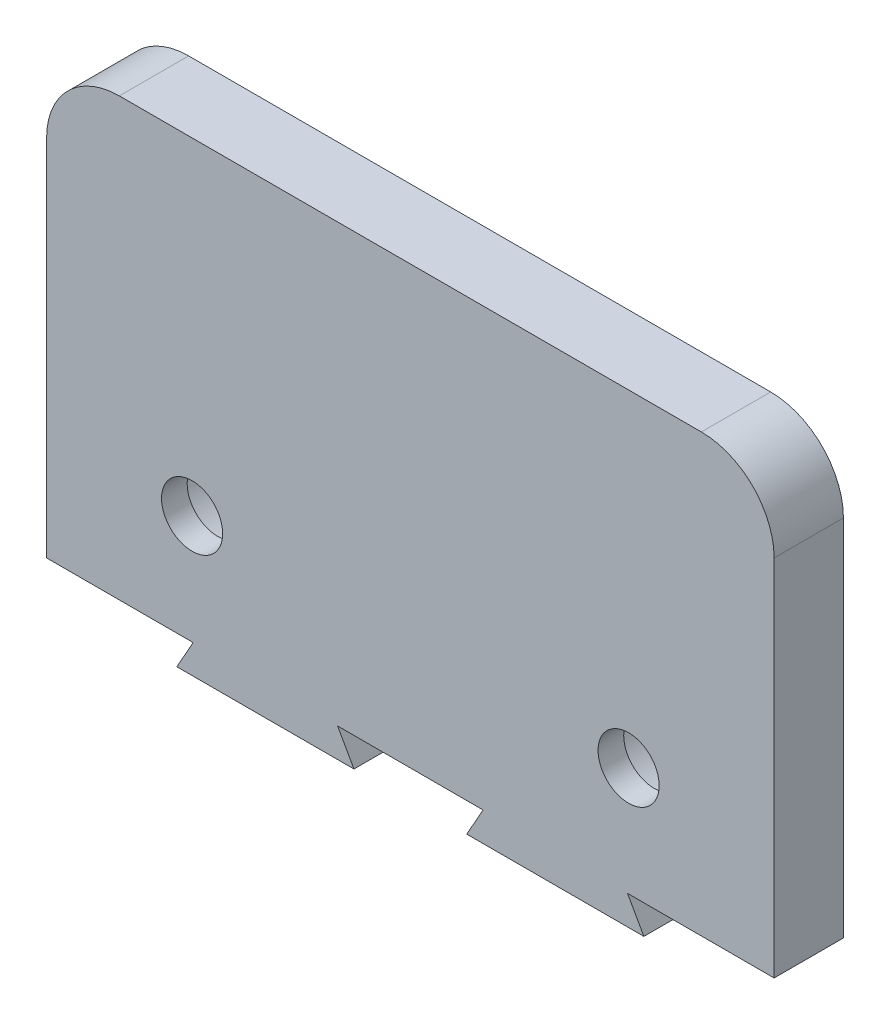
ISO-10303-21;
HEADER;
FILE_DESCRIPTION(('STEP AP214'),'2;1');
FILE_NAME('part.step','',(''),(''),'','','');
FILE_SCHEMA(('AUTOMOTIVE_DESIGN { 1 0 10303 214 1 1 1 1 }'));
ENDSEC;
DATA;
#1=APPLICATION_CONTEXT('core data for automotive mechanical design processes');
#2=APPLICATION_PROTOCOL_DEFINITION('international standard','automotive_design',2000,#1);
#3=PRODUCT_CONTEXT('',#1,'mechanical');
#4=PRODUCT('Part','Part','',(#3));
#5=PRODUCT_RELATED_PRODUCT_CATEGORY('part','',(#4));
#6=PRODUCT_DEFINITION_FORMATION('','',#4);
#7=PRODUCT_DEFINITION_CONTEXT('part definition',#1,'design');
#8=PRODUCT_DEFINITION('design','',#6,#7);
#9=PRODUCT_DEFINITION_SHAPE('','',#8);
#10=(LENGTH_UNIT() NAMED_UNIT(*) SI_UNIT(.MILLI.,.METRE.));
#11=(NAMED_UNIT(*) PLANE_ANGLE_UNIT() SI_UNIT($,.RADIAN.));
#12=(NAMED_UNIT(*) SI_UNIT($,.STERADIAN.) SOLID_ANGLE_UNIT());
#13=UNCERTAINTY_MEASURE_WITH_UNIT(LENGTH_MEASURE(1.E-05),#10,'distance_accuracy_value','');
#14=(GEOMETRIC_REPRESENTATION_CONTEXT(3) GLOBAL_UNCERTAINTY_ASSIGNED_CONTEXT((#13)) GLOBAL_UNIT_ASSIGNED_CONTEXT((#10,
#11,#12)) REPRESENTATION_CONTEXT('',''));
#15=CARTESIAN_POINT('',(0.,0.,0.));
#16=DIRECTION('',(0.,0.,1.));
#17=DIRECTION('',(1.,0.,0.));
#18=AXIS2_PLACEMENT_3D('',#15,#16,#17);
#19=CARTESIAN_POINT('',(0.,0.,0.));
#20=DIRECTION('',(0.,1.,0.));
#21=DIRECTION('',(0.,0.,1.));
#22=AXIS2_PLACEMENT_3D('',#19,#20,#21);
#23=PLANE('',#22);
#24=DIRECTION('',(1.,0.,0.));
#25=VECTOR('',#24,1.);
#26=CARTESIAN_POINT('',(50.0000000000001,0.,4.7625));
#27=LINE('',#26,#25);
#28=CARTESIAN_POINT('',(29.85,0.,4.76250000000001));
#29=VERTEX_POINT('',#28);
#30=CARTESIAN_POINT('',(50.0000000000001,0.,4.7625));
#31=VERTEX_POINT('',#30);
#32=EDGE_CURVE('E170',#29,#31,#27,.T.);
#33=ORIENTED_EDGE('',*,*,#32,.F.);
#34=DIRECTION('',(0.,0.,-1.));
#35=VECTOR('',#34,1.);
#36=CARTESIAN_POINT('',(29.85,0.,4.76250000000001));
#37=LINE('',#36,#35);
#38=CARTESIAN_POINT('',(29.85,0.,-4.7625));
#39=VERTEX_POINT('',#38);
#40=EDGE_CURVE('E154',#29,#39,#37,.T.);
#41=ORIENTED_EDGE('',*,*,#40,.T.);
#42=DIRECTION('',(-1.,0.,0.));
#43=VECTOR('',#42,1.);
#44=CARTESIAN_POINT('',(50.0000000000001,0.,-4.7625));
#45=LINE('',#44,#43);
#46=CARTESIAN_POINT('',(50.0000000000001,0.,-4.7625));
#47=VERTEX_POINT('',#46);
#48=EDGE_CURVE('E168',#47,#39,#45,.T.);
#49=ORIENTED_EDGE('',*,*,#48,.F.);
#50=DIRECTION('',(0.,0.,-1.));
#51=VECTOR('',#50,1.);
#52=CARTESIAN_POINT('',(50.0000000000001,0.,4.7625));
#53=LINE('',#52,#51);
#54=EDGE_CURVE('E188',#31,#47,#53,.T.);
#55=ORIENTED_EDGE('',*,*,#54,.F.);
#56=EDGE_LOOP('',(#33,#41,#49,#55));
#57=FACE_BOUND('',#56,.T.);
#58=ADVANCED_FACE('F48',(#57),#23,.F.);
#59=DIRECTION('',(0.,0.,-1.));
#60=VECTOR('',#59,1.);
#61=CARTESIAN_POINT('',(-29.85,0.,4.76250000000001));
#62=LINE('',#61,#60);
#63=CARTESIAN_POINT('',(-29.85,0.,4.76250000000001));
#64=VERTEX_POINT('',#63);
#65=CARTESIAN_POINT('',(-29.85,0.,-4.7625));
#66=VERTEX_POINT('',#65);
#67=EDGE_CURVE('E210',#64,#66,#62,.T.);
#68=ORIENTED_EDGE('',*,*,#67,.F.);
#69=CARTESIAN_POINT('',(-50.,0.,4.76250000000001));
#70=VERTEX_POINT('',#69);
#71=EDGE_CURVE('E192',#70,#64,#27,.T.);
#72=ORIENTED_EDGE('',*,*,#71,.F.);
#73=DIRECTION('',(0.,0.,1.));
#74=VECTOR('',#73,1.);
#75=CARTESIAN_POINT('',(-50.,0.,4.76250000000001));
#76=LINE('',#75,#74);
#77=CARTESIAN_POINT('',(-50.,0.,-4.76249999999999));
#78=VERTEX_POINT('',#77);
#79=EDGE_CURVE('E197',#78,#70,#76,.T.);
#80=ORIENTED_EDGE('',*,*,#79,.F.);
#81=EDGE_CURVE('E181',#66,#78,#45,.T.);
#82=ORIENTED_EDGE('',*,*,#81,.F.);
#83=EDGE_LOOP('',(#68,#72,#80,#82));
#84=FACE_BOUND('',#83,.T.);
#85=ADVANCED_FACE('F296',(#84),#23,.F.);
#86=CARTESIAN_POINT('',(-50.,60.,4.76250000000001));
#87=DIRECTION('',(1.,0.,0.));
#88=DIRECTION('',(0.,0.,-1.));
#89=AXIS2_PLACEMENT_3D('',#86,#87,#88);
#90=PLANE('',#89);
#91=DIRECTION('',(0.,-1.,0.));
#92=VECTOR('',#91,1.);
#93=CARTESIAN_POINT('',(-50.,60.,4.76250000000001));
#94=LINE('',#93,#92);
#95=CARTESIAN_POINT('',(-50.,50.,4.76250000000001));
#96=VERTEX_POINT('',#95);
#97=EDGE_CURVE('E332',#96,#70,#94,.T.);
#98=ORIENTED_EDGE('',*,*,#97,.F.);
#99=DIRECTION('',(0.,0.,1.));
#100=VECTOR('',#99,1.);
#101=CARTESIAN_POINT('',(-50.,50.,-4.76249999999999));
#102=LINE('',#101,#100);
#103=CARTESIAN_POINT('',(-50.,50.,-4.76249999999999));
#104=VERTEX_POINT('',#103);
#105=EDGE_CURVE('E13',#96,#104,#102,.F.);
#106=ORIENTED_EDGE('',*,*,#105,.T.);
#107=DIRECTION('',(0.,-1.,0.));
#108=VECTOR('',#107,1.);
#109=CARTESIAN_POINT('',(-50.,60.,-4.76249999999999));
#110=LINE('',#109,#108);
#111=EDGE_CURVE('E202',#104,#78,#110,.T.);
#112=ORIENTED_EDGE('',*,*,#111,.T.);
#113=ORIENTED_EDGE('',*,*,#79,.T.);
#114=EDGE_LOOP('',(#98,#106,#112,#113));
#115=FACE_BOUND('',#114,.T.);
#116=ADVANCED_FACE('F302',(#115),#90,.F.);
#117=CARTESIAN_POINT('',(50.0000000000001,60.,4.7625));
#118=DIRECTION('',(0.,0.,-1.));
#119=DIRECTION('',(-1.,0.,0.));
#120=AXIS2_PLACEMENT_3D('',#117,#118,#119);
#121=PLANE('',#120);
#122=CARTESIAN_POINT('',(30.,15.,4.7625));
#123=DIRECTION('',(0.,0.,-1.));
#124=DIRECTION('',(-1.,0.,0.));
#125=AXIS2_PLACEMENT_3D('',#122,#123,#124);
#126=CIRCLE('',#125,4.2);
#127=CARTESIAN_POINT('',(25.8,15.,4.7625));
#128=VERTEX_POINT('',#127);
#129=EDGE_CURVE('E52',#128,#128,#126,.T.);
#130=ORIENTED_EDGE('',*,*,#129,.T.);
#131=EDGE_LOOP('',(#130));
#132=FACE_BOUND('',#131,.T.);
#133=CARTESIAN_POINT('',(-30.,15.,4.76250000000001));
#134=DIRECTION('',(0.,0.,-1.));
#135=DIRECTION('',(-1.,0.,0.));
#136=AXIS2_PLACEMENT_3D('',#133,#134,#135);
#137=CIRCLE('',#136,4.2);
#138=CARTESIAN_POINT('',(-34.2,15.,4.76250000000001));
#139=VERTEX_POINT('',#138);
#140=EDGE_CURVE('E162',#139,#139,#137,.T.);
#141=ORIENTED_EDGE('',*,*,#140,.T.);
#142=EDGE_LOOP('',(#141));
#143=FACE_BOUND('',#142,.T.);
#144=DIRECTION('',(0.,-1.,0.));
#145=VECTOR('',#144,1.);
#146=CARTESIAN_POINT('',(50.0000000000001,60.,4.7625));
#147=LINE('',#146,#145);
#148=CARTESIAN_POINT('',(50.0000000000001,50.,4.7625));
#149=VERTEX_POINT('',#148);
#150=EDGE_CURVE('E330',#149,#31,#147,.T.);
#151=ORIENTED_EDGE('',*,*,#150,.F.);
#152=CARTESIAN_POINT('',(40.0000000000001,50.,4.7625));
#153=DIRECTION('',(0.,0.,-1.));
#154=DIRECTION('',(-1.,0.,0.));
#155=AXIS2_PLACEMENT_3D('',#152,#153,#154);
#156=CIRCLE('',#155,10.);
#157=CARTESIAN_POINT('',(40.0000000000001,60.,4.7625));
#158=VERTEX_POINT('',#157);
#159=EDGE_CURVE('E57',#149,#158,#156,.F.);
#160=ORIENTED_EDGE('',*,*,#159,.T.);
#161=DIRECTION('',(1.,0.,0.));
#162=VECTOR('',#161,1.);
#163=CARTESIAN_POINT('',(50.0000000000001,60.,4.7625));
#164=LINE('',#163,#162);
#165=CARTESIAN_POINT('',(-39.9999999999999,60.,4.76250000000001));
#166=VERTEX_POINT('',#165);
#167=EDGE_CURVE('E178',#166,#158,#164,.T.);
#168=ORIENTED_EDGE('',*,*,#167,.F.);
#169=CARTESIAN_POINT('',(-39.9999999999999,50.,4.76250000000001));
#170=DIRECTION('',(0.,0.,-1.));
#171=DIRECTION('',(-1.,0.,0.));
#172=AXIS2_PLACEMENT_3D('',#169,#170,#171);
#173=CIRCLE('',#172,10.);
#174=EDGE_CURVE('E65',#166,#96,#173,.F.);
#175=ORIENTED_EDGE('',*,*,#174,.T.);
#176=ORIENTED_EDGE('',*,*,#97,.T.);
#177=ORIENTED_EDGE('',*,*,#71,.T.);
#178=DIRECTION('',(-0.490261239632559,-0.871575537124549,0.));
#179=VECTOR('',#178,1.);
#180=CARTESIAN_POINT('',(-32.1,-4.,4.76250000000001));
#181=LINE('',#180,#179);
#182=CARTESIAN_POINT('',(-32.1,-4.,4.76250000000001));
#183=VERTEX_POINT('',#182);
#184=EDGE_CURVE('E218',#64,#183,#181,.T.);
#185=ORIENTED_EDGE('',*,*,#184,.T.);
#186=DIRECTION('',(1.,0.,0.));
#187=VECTOR('',#186,1.);
#188=CARTESIAN_POINT('',(-7.75,-4.,4.76250000000001));
#189=LINE('',#188,#187);
#190=CARTESIAN_POINT('',(-7.75,-4.,4.76250000000001));
#191=VERTEX_POINT('',#190);
#192=EDGE_CURVE('E216',#183,#191,#189,.T.);
#193=ORIENTED_EDGE('',*,*,#192,.T.);
#194=DIRECTION('',(-0.490261239632559,0.871575537124549,0.));
#195=VECTOR('',#194,1.);
#196=CARTESIAN_POINT('',(-10.,0.,4.76250000000001));
#197=LINE('',#196,#195);
#198=CARTESIAN_POINT('',(-10.,0.,4.7625));
#199=VERTEX_POINT('',#198);
#200=EDGE_CURVE('E213',#191,#199,#197,.T.);
#201=ORIENTED_EDGE('',*,*,#200,.T.);
#202=CARTESIAN_POINT('',(10.,0.,4.76250000000001));
#203=VERTEX_POINT('',#202);
#204=EDGE_CURVE('E194',#199,#203,#27,.T.);
#205=ORIENTED_EDGE('',*,*,#204,.T.);
#206=DIRECTION('',(0.490261239632559,0.871575537124549,0.));
#207=VECTOR('',#206,1.);
#208=CARTESIAN_POINT('',(10.,0.,4.76250000000001));
#209=LINE('',#208,#207);
#210=CARTESIAN_POINT('',(7.75,-4.,4.76250000000001));
#211=VERTEX_POINT('',#210);
#212=EDGE_CURVE('E237',#211,#203,#209,.T.);
#213=ORIENTED_EDGE('',*,*,#212,.F.);
#214=DIRECTION('',(-1.,0.,0.));
#215=VECTOR('',#214,1.);
#216=CARTESIAN_POINT('',(7.75,-4.,4.76250000000001));
#217=LINE('',#216,#215);
#218=CARTESIAN_POINT('',(32.1,-4.,4.76250000000001));
#219=VERTEX_POINT('',#218);
#220=EDGE_CURVE('E234',#219,#211,#217,.T.);
#221=ORIENTED_EDGE('',*,*,#220,.F.);
#222=DIRECTION('',(0.490261239632559,-0.871575537124549,0.));
#223=VECTOR('',#222,1.);
#224=CARTESIAN_POINT('',(32.1,-4.,4.76250000000001));
#225=LINE('',#224,#223);
#226=EDGE_CURVE('E239',#29,#219,#225,.T.);
#227=ORIENTED_EDGE('',*,*,#226,.F.);
#228=ORIENTED_EDGE('',*,*,#32,.T.);
#229=EDGE_LOOP('',(#151,#160,#168,#175,#176,#177,#185,#193,#201,#205,#213,#221,#227,#228));
#230=FACE_BOUND('',#229,.T.);
#231=ADVANCED_FACE('F327',(#132,#143,#230),#121,.F.);
#232=CARTESIAN_POINT('',(50.0000000000001,60.,4.7625));
#233=DIRECTION('',(-1.,0.,0.));
#234=DIRECTION('',(0.,0.,1.));
#235=AXIS2_PLACEMENT_3D('',#232,#233,#234);
#236=PLANE('',#235);
#237=DIRECTION('',(0.,-1.,0.));
#238=VECTOR('',#237,1.);
#239=CARTESIAN_POINT('',(50.0000000000001,60.,-4.7625));
#240=LINE('',#239,#238);
#241=CARTESIAN_POINT('',(50.0000000000001,50.,-4.7625));
#242=VERTEX_POINT('',#241);
#243=EDGE_CURVE('E176',#242,#47,#240,.T.);
#244=ORIENTED_EDGE('',*,*,#243,.F.);
#245=DIRECTION('',(0.,0.,-1.));
#246=VECTOR('',#245,1.);
#247=CARTESIAN_POINT('',(50.0000000000001,50.,4.7625));
#248=LINE('',#247,#246);
#249=EDGE_CURVE('E73',#242,#149,#248,.F.);
#250=ORIENTED_EDGE('',*,*,#249,.T.);
#251=ORIENTED_EDGE('',*,*,#150,.T.);
#252=ORIENTED_EDGE('',*,*,#54,.T.);
#253=EDGE_LOOP('',(#244,#250,#251,#252));
#254=FACE_BOUND('',#253,.T.);
#255=ADVANCED_FACE('F274',(#254),#236,.F.);
#256=CARTESIAN_POINT('',(50.0000000000001,60.,-4.7625));
#257=DIRECTION('',(0.,0.,1.));
#258=DIRECTION('',(1.,0.,0.));
#259=AXIS2_PLACEMENT_3D('',#256,#257,#258);
#260=PLANE('',#259);
#261=CARTESIAN_POINT('',(30.,15.,-4.7625));
#262=DIRECTION('',(0.,0.,-1.));
#263=DIRECTION('',(-1.,0.,0.));
#264=AXIS2_PLACEMENT_3D('',#261,#262,#263);
#265=CIRCLE('',#264,9.025);
#266=CARTESIAN_POINT('',(20.975,15.,-4.7625));
#267=VERTEX_POINT('',#266);
#268=EDGE_CURVE('E265',#267,#267,#265,.T.);
#269=ORIENTED_EDGE('',*,*,#268,.F.);
#270=EDGE_LOOP('',(#269));
#271=FACE_BOUND('',#270,.T.);
#272=CARTESIAN_POINT('',(-30.,15.,-4.76249999999999));
#273=DIRECTION('',(0.,0.,-1.));
#274=DIRECTION('',(-1.,0.,0.));
#275=AXIS2_PLACEMENT_3D('',#272,#273,#274);
#276=CIRCLE('',#275,9.025);
#277=CARTESIAN_POINT('',(-39.025,15.,-4.76249999999999));
#278=VERTEX_POINT('',#277);
#279=EDGE_CURVE('E253',#278,#278,#276,.T.);
#280=ORIENTED_EDGE('',*,*,#279,.F.);
#281=EDGE_LOOP('',(#280));
#282=FACE_BOUND('',#281,.T.);
#283=DIRECTION('',(-1.,0.,0.));
#284=VECTOR('',#283,1.);
#285=CARTESIAN_POINT('',(50.0000000000001,60.,-4.7625));
#286=LINE('',#285,#284);
#287=CARTESIAN_POINT('',(40.0000000000001,60.,-4.7625));
#288=VERTEX_POINT('',#287);
#289=CARTESIAN_POINT('',(-39.9999999999999,60.,-4.76249999999999));
#290=VERTEX_POINT('',#289);
#291=EDGE_CURVE('E183',#288,#290,#286,.T.);
#292=ORIENTED_EDGE('',*,*,#291,.F.);
#293=CARTESIAN_POINT('',(40.0000000000001,50.,-4.7625));
#294=DIRECTION('',(0.,0.,1.));
#295=DIRECTION('',(1.,0.,0.));
#296=AXIS2_PLACEMENT_3D('',#293,#294,#295);
#297=CIRCLE('',#296,10.);
#298=EDGE_CURVE('E387',#288,#242,#297,.F.);
#299=ORIENTED_EDGE('',*,*,#298,.T.);
#300=ORIENTED_EDGE('',*,*,#243,.T.);
#301=ORIENTED_EDGE('',*,*,#48,.T.);
#302=DIRECTION('',(0.490261239632559,-0.871575537124549,0.));
#303=VECTOR('',#302,1.);
#304=CARTESIAN_POINT('',(32.1,-4.,-4.7625));
#305=LINE('',#304,#303);
#306=CARTESIAN_POINT('',(32.1,-4.,-4.7625));
#307=VERTEX_POINT('',#306);
#308=EDGE_CURVE('E150',#39,#307,#305,.T.);
#309=ORIENTED_EDGE('',*,*,#308,.T.);
#310=DIRECTION('',(-1.,0.,0.));
#311=VECTOR('',#310,1.);
#312=CARTESIAN_POINT('',(7.75,-4.,-4.7625));
#313=LINE('',#312,#311);
#314=CARTESIAN_POINT('',(7.75,-4.,-4.7625));
#315=VERTEX_POINT('',#314);
#316=EDGE_CURVE('E241',#307,#315,#313,.T.);
#317=ORIENTED_EDGE('',*,*,#316,.T.);
#318=DIRECTION('',(0.490261239632559,0.871575537124549,0.));
#319=VECTOR('',#318,1.);
#320=CARTESIAN_POINT('',(10.,0.,-4.7625));
#321=LINE('',#320,#319);
#322=CARTESIAN_POINT('',(10.,0.,-4.7625));
#323=VERTEX_POINT('',#322);
#324=EDGE_CURVE('E161',#315,#323,#321,.T.);
#325=ORIENTED_EDGE('',*,*,#324,.T.);
#326=CARTESIAN_POINT('',(-10.,0.,-4.76249999999999));
#327=VERTEX_POINT('',#326);
#328=EDGE_CURVE('E179',#323,#327,#45,.T.);
#329=ORIENTED_EDGE('',*,*,#328,.T.);
#330=DIRECTION('',(-0.490261239632559,0.871575537124549,0.));
#331=VECTOR('',#330,1.);
#332=CARTESIAN_POINT('',(-10.,0.,-4.7625));
#333=LINE('',#332,#331);
#334=CARTESIAN_POINT('',(-7.75,-4.,-4.7625));
#335=VERTEX_POINT('',#334);
#336=EDGE_CURVE('E221',#335,#327,#333,.T.);
#337=ORIENTED_EDGE('',*,*,#336,.F.);
#338=DIRECTION('',(1.,0.,0.));
#339=VECTOR('',#338,1.);
#340=CARTESIAN_POINT('',(-7.75,-4.,-4.7625));
#341=LINE('',#340,#339);
#342=CARTESIAN_POINT('',(-32.1,-4.,-4.7625));
#343=VERTEX_POINT('',#342);
#344=EDGE_CURVE('E224',#343,#335,#341,.T.);
#345=ORIENTED_EDGE('',*,*,#344,.F.);
#346=DIRECTION('',(-0.490261239632559,-0.871575537124549,0.));
#347=VECTOR('',#346,1.);
#348=CARTESIAN_POINT('',(-32.1,-4.,-4.7625));
#349=LINE('',#348,#347);
#350=EDGE_CURVE('E171',#66,#343,#349,.T.);
#351=ORIENTED_EDGE('',*,*,#350,.F.);
#352=ORIENTED_EDGE('',*,*,#81,.T.);
#353=ORIENTED_EDGE('',*,*,#111,.F.);
#354=CARTESIAN_POINT('',(-39.9999999999999,50.,-4.76249999999999));
#355=DIRECTION('',(0.,0.,1.));
#356=DIRECTION('',(1.,0.,0.));
#357=AXIS2_PLACEMENT_3D('',#354,#355,#356);
#358=CIRCLE('',#357,10.);
#359=EDGE_CURVE('E385',#104,#290,#358,.F.);
#360=ORIENTED_EDGE('',*,*,#359,.T.);
#361=EDGE_LOOP('',(#292,#299,#300,#301,#309,#317,#325,#329,#337,#345,#351,#352,#353,#360));
#362=FACE_BOUND('',#361,.T.);
#363=ADVANCED_FACE('F175',(#271,#282,#362),#260,.F.);
#364=CARTESIAN_POINT('',(0.,60.,0.));
#365=DIRECTION('',(0.,1.,0.));
#366=DIRECTION('',(0.,0.,1.));
#367=AXIS2_PLACEMENT_3D('',#364,#365,#366);
#368=PLANE('',#367);
#369=ORIENTED_EDGE('',*,*,#167,.T.);
#370=DIRECTION('',(0.,0.,-1.));
#371=VECTOR('',#370,1.);
#372=CARTESIAN_POINT('',(40.0000000000001,60.,-4.7625));
#373=LINE('',#372,#371);
#374=EDGE_CURVE('E338',#158,#288,#373,.T.);
#375=ORIENTED_EDGE('',*,*,#374,.T.);
#376=ORIENTED_EDGE('',*,*,#291,.T.);
#377=DIRECTION('',(0.,0.,1.));
#378=VECTOR('',#377,1.);
#379=CARTESIAN_POINT('',(-39.9999999999999,60.,4.76250000000001));
#380=LINE('',#379,#378);
#381=EDGE_CURVE('E378',#290,#166,#380,.T.);
#382=ORIENTED_EDGE('',*,*,#381,.T.);
#383=EDGE_LOOP('',(#369,#375,#376,#382));
#384=FACE_BOUND('',#383,.T.);
#385=ADVANCED_FACE('F273',(#384),#368,.T.);
#386=ORIENTED_EDGE('',*,*,#328,.F.);
#387=DIRECTION('',(0.,0.,-1.));
#388=VECTOR('',#387,1.);
#389=CARTESIAN_POINT('',(10.,0.,4.76250000000001));
#390=LINE('',#389,#388);
#391=EDGE_CURVE('E172',#203,#323,#390,.T.);
#392=ORIENTED_EDGE('',*,*,#391,.F.);
#393=ORIENTED_EDGE('',*,*,#204,.F.);
#394=DIRECTION('',(0.,0.,-1.));
#395=VECTOR('',#394,1.);
#396=CARTESIAN_POINT('',(-10.,0.,4.76250000000001));
#397=LINE('',#396,#395);
#398=EDGE_CURVE('E207',#199,#327,#397,.T.);
#399=ORIENTED_EDGE('',*,*,#398,.T.);
#400=EDGE_LOOP('',(#386,#392,#393,#399));
#401=FACE_BOUND('',#400,.T.);
#402=ADVANCED_FACE('F298',(#401),#23,.F.);
#403=CARTESIAN_POINT('',(-32.1,-4.,4.76250000000001));
#404=DIRECTION('',(0.871575537124549,-0.490261239632559,0.));
#405=DIRECTION('',(0.490261239632559,0.871575537124549,0.));
#406=AXIS2_PLACEMENT_3D('',#403,#404,#405);
#407=PLANE('',#406);
#408=ORIENTED_EDGE('',*,*,#67,.T.);
#409=ORIENTED_EDGE('',*,*,#350,.T.);
#410=DIRECTION('',(0.,0.,-1.));
#411=VECTOR('',#410,1.);
#412=CARTESIAN_POINT('',(-32.1,-4.,4.76250000000001));
#413=LINE('',#412,#411);
#414=EDGE_CURVE('E200',#183,#343,#413,.T.);
#415=ORIENTED_EDGE('',*,*,#414,.F.);
#416=ORIENTED_EDGE('',*,*,#184,.F.);
#417=EDGE_LOOP('',(#408,#409,#415,#416));
#418=FACE_BOUND('',#417,.T.);
#419=ADVANCED_FACE('F306',(#418),#407,.F.);
#420=CARTESIAN_POINT('',(-7.75,-4.,4.76250000000001));
#421=DIRECTION('',(0.,1.,0.));
#422=DIRECTION('',(0.,0.,1.));
#423=AXIS2_PLACEMENT_3D('',#420,#421,#422);
#424=PLANE('',#423);
#425=ORIENTED_EDGE('',*,*,#414,.T.);
#426=ORIENTED_EDGE('',*,*,#344,.T.);
#427=DIRECTION('',(0.,0.,-1.));
#428=VECTOR('',#427,1.);
#429=CARTESIAN_POINT('',(-7.75,-4.,4.76250000000001));
#430=LINE('',#429,#428);
#431=EDGE_CURVE('E205',#191,#335,#430,.T.);
#432=ORIENTED_EDGE('',*,*,#431,.F.);
#433=ORIENTED_EDGE('',*,*,#192,.F.);
#434=EDGE_LOOP('',(#425,#426,#432,#433));
#435=FACE_BOUND('',#434,.T.);
#436=ADVANCED_FACE('F312',(#435),#424,.F.);
#437=CARTESIAN_POINT('',(-10.,0.,4.76250000000001));
#438=DIRECTION('',(-0.871575537124549,-0.490261239632559,0.));
#439=DIRECTION('',(0.490261239632559,-0.871575537124549,0.));
#440=AXIS2_PLACEMENT_3D('',#437,#438,#439);
#441=PLANE('',#440);
#442=ORIENTED_EDGE('',*,*,#431,.T.);
#443=ORIENTED_EDGE('',*,*,#336,.T.);
#444=ORIENTED_EDGE('',*,*,#398,.F.);
#445=ORIENTED_EDGE('',*,*,#200,.F.);
#446=EDGE_LOOP('',(#442,#443,#444,#445));
#447=FACE_BOUND('',#446,.T.);
#448=ADVANCED_FACE('F364',(#447),#441,.F.);
#449=CARTESIAN_POINT('',(32.1,-4.,4.76250000000001));
#450=DIRECTION('',(0.871575537124549,0.490261239632559,0.));
#451=DIRECTION('',(-0.490261239632559,0.871575537124549,0.));
#452=AXIS2_PLACEMENT_3D('',#449,#450,#451);
#453=PLANE('',#452);
#454=DIRECTION('',(0.,0.,-1.));
#455=VECTOR('',#454,1.);
#456=CARTESIAN_POINT('',(32.1,-4.,4.76250000000001));
#457=LINE('',#456,#455);
#458=EDGE_CURVE('E156',#219,#307,#457,.T.);
#459=ORIENTED_EDGE('',*,*,#458,.T.);
#460=ORIENTED_EDGE('',*,*,#308,.F.);
#461=ORIENTED_EDGE('',*,*,#40,.F.);
#462=ORIENTED_EDGE('',*,*,#226,.T.);
#463=EDGE_LOOP('',(#459,#460,#461,#462));
#464=FACE_BOUND('',#463,.T.);
#465=ADVANCED_FACE('F152',(#464),#453,.T.);
#466=CARTESIAN_POINT('',(10.,0.,4.76250000000001));
#467=DIRECTION('',(-0.871575537124549,0.490261239632559,0.));
#468=DIRECTION('',(-0.490261239632559,-0.871575537124549,0.));
#469=AXIS2_PLACEMENT_3D('',#466,#467,#468);
#470=PLANE('',#469);
#471=ORIENTED_EDGE('',*,*,#391,.T.);
#472=ORIENTED_EDGE('',*,*,#324,.F.);
#473=DIRECTION('',(0.,0.,-1.));
#474=VECTOR('',#473,1.);
#475=CARTESIAN_POINT('',(7.75,-4.,4.76250000000001));
#476=LINE('',#475,#474);
#477=EDGE_CURVE('E231',#211,#315,#476,.T.);
#478=ORIENTED_EDGE('',*,*,#477,.F.);
#479=ORIENTED_EDGE('',*,*,#212,.T.);
#480=EDGE_LOOP('',(#471,#472,#478,#479));
#481=FACE_BOUND('',#480,.T.);
#482=ADVANCED_FACE('F324',(#481),#470,.T.);
#483=CARTESIAN_POINT('',(7.75,-4.,4.76250000000001));
#484=DIRECTION('',(0.,-1.,0.));
#485=DIRECTION('',(0.,0.,-1.));
#486=AXIS2_PLACEMENT_3D('',#483,#484,#485);
#487=PLANE('',#486);
#488=ORIENTED_EDGE('',*,*,#477,.T.);
#489=ORIENTED_EDGE('',*,*,#316,.F.);
#490=ORIENTED_EDGE('',*,*,#458,.F.);
#491=ORIENTED_EDGE('',*,*,#220,.T.);
#492=EDGE_LOOP('',(#488,#489,#490,#491));
#493=FACE_BOUND('',#492,.T.);
#494=ADVANCED_FACE('F329',(#493),#487,.T.);
#495=CARTESIAN_POINT('',(40.0000000000001,50.,0.));
#496=DIRECTION('',(0.,0.,1.));
#497=DIRECTION('',(1.,0.,0.));
#498=AXIS2_PLACEMENT_3D('',#495,#496,#497);
#499=CYLINDRICAL_SURFACE('',#498,10.);
#500=ORIENTED_EDGE('',*,*,#159,.F.);
#501=ORIENTED_EDGE('',*,*,#249,.F.);
#502=ORIENTED_EDGE('',*,*,#298,.F.);
#503=ORIENTED_EDGE('',*,*,#374,.F.);
#504=EDGE_LOOP('',(#500,#501,#502,#503));
#505=FACE_BOUND('',#504,.T.);
#506=ADVANCED_FACE('F336',(#505),#499,.T.);
#507=CARTESIAN_POINT('',(-39.9999999999999,50.,0.));
#508=DIRECTION('',(0.,0.,-1.));
#509=DIRECTION('',(-1.,0.,0.));
#510=AXIS2_PLACEMENT_3D('',#507,#508,#509);
#511=CYLINDRICAL_SURFACE('',#510,10.);
#512=ORIENTED_EDGE('',*,*,#359,.F.);
#513=ORIENTED_EDGE('',*,*,#105,.F.);
#514=ORIENTED_EDGE('',*,*,#174,.F.);
#515=ORIENTED_EDGE('',*,*,#381,.F.);
#516=EDGE_LOOP('',(#512,#513,#514,#515));
#517=FACE_BOUND('',#516,.T.);
#518=ADVANCED_FACE('F50',(#517),#511,.T.);
#519=CARTESIAN_POINT('',(-30.,15.,-4.76249999999999));
#520=DIRECTION('',(0.,0.,-1.));
#521=DIRECTION('',(-1.,0.,0.));
#522=AXIS2_PLACEMENT_3D('',#519,#520,#521);
#523=CYLINDRICAL_SURFACE('',#522,4.2);
#524=CARTESIAN_POINT('',(-30.,15.,1.2375));
#525=DIRECTION('',(0.,0.,-1.));
#526=DIRECTION('',(-1.,0.,0.));
#527=AXIS2_PLACEMENT_3D('',#524,#525,#526);
#528=CIRCLE('',#527,4.2);
#529=CARTESIAN_POINT('',(-34.2,15.,1.2375));
#530=VERTEX_POINT('',#529);
#531=EDGE_CURVE('E244',#530,#530,#528,.T.);
#532=ORIENTED_EDGE('',*,*,#531,.T.);
#533=EDGE_LOOP('',(#532));
#534=FACE_BOUND('',#533,.T.);
#535=ORIENTED_EDGE('',*,*,#140,.F.);
#536=EDGE_LOOP('',(#535));
#537=FACE_BOUND('',#536,.T.);
#538=ADVANCED_FACE('F346',(#534,#537),#523,.F.);
#539=CARTESIAN_POINT('',(-25.8,15.,1.2375));
#540=DIRECTION('',(0.,0.,1.));
#541=DIRECTION('',(1.,0.,0.));
#542=AXIS2_PLACEMENT_3D('',#539,#540,#541);
#543=PLANE('',#542);
#544=ORIENTED_EDGE('',*,*,#531,.F.);
#545=EDGE_LOOP('',(#544));
#546=FACE_BOUND('',#545,.T.);
#547=CARTESIAN_POINT('',(-30.,15.,1.2375));
#548=DIRECTION('',(0.,0.,-1.));
#549=DIRECTION('',(-1.,0.,0.));
#550=AXIS2_PLACEMENT_3D('',#547,#548,#549);
#551=CIRCLE('',#550,9.);
#552=CARTESIAN_POINT('',(-39.,15.,1.2375));
#553=VERTEX_POINT('',#552);
#554=EDGE_CURVE('E247',#553,#553,#551,.T.);
#555=ORIENTED_EDGE('',*,*,#554,.T.);
#556=EDGE_LOOP('',(#555));
#557=FACE_BOUND('',#556,.T.);
#558=ADVANCED_FACE('F291',(#546,#557),#543,.F.);
#559=CARTESIAN_POINT('',(-30.,15.,-4.76249999999999));
#560=DIRECTION('',(0.,0.,-1.));
#561=DIRECTION('',(-1.,0.,0.));
#562=AXIS2_PLACEMENT_3D('',#559,#560,#561);
#563=CYLINDRICAL_SURFACE('',#562,9.);
#564=ORIENTED_EDGE('',*,*,#554,.F.);
#565=EDGE_LOOP('',(#564));
#566=FACE_BOUND('',#565,.T.);
#567=CARTESIAN_POINT('',(-30.,15.,-4.7375));
#568=DIRECTION('',(0.,0.,-1.));
#569=DIRECTION('',(-1.,0.,0.));
#570=AXIS2_PLACEMENT_3D('',#567,#568,#569);
#571=CIRCLE('',#570,9.);
#572=CARTESIAN_POINT('',(-39.,15.,-4.7375));
#573=VERTEX_POINT('',#572);
#574=EDGE_CURVE('E250',#573,#573,#571,.T.);
#575=ORIENTED_EDGE('',*,*,#574,.T.);
#576=EDGE_LOOP('',(#575));
#577=FACE_BOUND('',#576,.T.);
#578=ADVANCED_FACE('F281',(#566,#577),#563,.F.);
#579=CARTESIAN_POINT('',(-30.,15.,-4.76249999999999));
#580=DIRECTION('',(0.,0.,-1.));
#581=DIRECTION('',(-1.,0.,0.));
#582=AXIS2_PLACEMENT_3D('',#579,#580,#581);
#583=CONICAL_SURFACE('',#582,9.025,0.785398163397518);
#584=ORIENTED_EDGE('',*,*,#574,.F.);
#585=EDGE_LOOP('',(#584));
#586=FACE_BOUND('',#585,.T.);
#587=ORIENTED_EDGE('',*,*,#279,.T.);
#588=EDGE_LOOP('',(#587));
#589=FACE_BOUND('',#588,.T.);
#590=ADVANCED_FACE('F278',(#586,#589),#583,.F.);
#591=CARTESIAN_POINT('',(30.,15.,-4.7625));
#592=DIRECTION('',(0.,0.,-1.));
#593=DIRECTION('',(-1.,0.,0.));
#594=AXIS2_PLACEMENT_3D('',#591,#592,#593);
#595=CYLINDRICAL_SURFACE('',#594,4.2);
#596=CARTESIAN_POINT('',(30.,15.,1.23749999999999));
#597=DIRECTION('',(0.,0.,-1.));
#598=DIRECTION('',(-1.,0.,0.));
#599=AXIS2_PLACEMENT_3D('',#596,#597,#598);
#600=CIRCLE('',#599,4.2);
#601=CARTESIAN_POINT('',(25.8,15.,1.23749999999999));
#602=VERTEX_POINT('',#601);
#603=EDGE_CURVE('E256',#602,#602,#600,.T.);
#604=ORIENTED_EDGE('',*,*,#603,.T.);
#605=EDGE_LOOP('',(#604));
#606=FACE_BOUND('',#605,.T.);
#607=ORIENTED_EDGE('',*,*,#129,.F.);
#608=EDGE_LOOP('',(#607));
#609=FACE_BOUND('',#608,.T.);
#610=ADVANCED_FACE('F280',(#606,#609),#595,.F.);
#611=CARTESIAN_POINT('',(34.2,15.,1.23749999999999));
#612=DIRECTION('',(0.,0.,1.));
#613=DIRECTION('',(1.,0.,0.));
#614=AXIS2_PLACEMENT_3D('',#611,#612,#613);
#615=PLANE('',#614);
#616=ORIENTED_EDGE('',*,*,#603,.F.);
#617=EDGE_LOOP('',(#616));
#618=FACE_BOUND('',#617,.T.);
#619=CARTESIAN_POINT('',(30.,15.,1.23749999999999));
#620=DIRECTION('',(0.,0.,-1.));
#621=DIRECTION('',(-1.,0.,0.));
#622=AXIS2_PLACEMENT_3D('',#619,#620,#621);
#623=CIRCLE('',#622,8.99999999999999);
#624=CARTESIAN_POINT('',(21.,15.,1.23749999999999));
#625=VERTEX_POINT('',#624);
#626=EDGE_CURVE('E259',#625,#625,#623,.T.);
#627=ORIENTED_EDGE('',*,*,#626,.T.);
#628=EDGE_LOOP('',(#627));
#629=FACE_BOUND('',#628,.T.);
#630=ADVANCED_FACE('F288',(#618,#629),#615,.F.);
#631=CARTESIAN_POINT('',(30.,15.,-4.7625));
#632=DIRECTION('',(0.,0.,-1.));
#633=DIRECTION('',(-1.,0.,0.));
#634=AXIS2_PLACEMENT_3D('',#631,#632,#633);
#635=CYLINDRICAL_SURFACE('',#634,8.99999999999999);
#636=ORIENTED_EDGE('',*,*,#626,.F.);
#637=EDGE_LOOP('',(#636));
#638=FACE_BOUND('',#637,.T.);
#639=CARTESIAN_POINT('',(30.,15.,-4.73750000000001));
#640=DIRECTION('',(0.,0.,-1.));
#641=DIRECTION('',(-1.,0.,0.));
#642=AXIS2_PLACEMENT_3D('',#639,#640,#641);
#643=CIRCLE('',#642,8.99999999999999);
#644=CARTESIAN_POINT('',(21.,15.,-4.73750000000001));
#645=VERTEX_POINT('',#644);
#646=EDGE_CURVE('E262',#645,#645,#643,.T.);
#647=ORIENTED_EDGE('',*,*,#646,.T.);
#648=EDGE_LOOP('',(#647));
#649=FACE_BOUND('',#648,.T.);
#650=ADVANCED_FACE('F460',(#638,#649),#635,.F.);
#651=CARTESIAN_POINT('',(30.,15.,-4.7625));
#652=DIRECTION('',(0.,0.,-1.));
#653=DIRECTION('',(-1.,0.,0.));
#654=AXIS2_PLACEMENT_3D('',#651,#652,#653);
#655=CONICAL_SURFACE('',#654,9.025,0.785398163397587);
#656=ORIENTED_EDGE('',*,*,#646,.F.);
#657=EDGE_LOOP('',(#656));
#658=FACE_BOUND('',#657,.T.);
#659=ORIENTED_EDGE('',*,*,#268,.T.);
#660=EDGE_LOOP('',(#659));
#661=FACE_BOUND('',#660,.T.);
#662=ADVANCED_FACE('F269',(#658,#661),#655,.F.);
#663=CLOSED_SHELL('',(#58,#85,#116,#231,#255,#363,#385,#402,#419,#436,#448,#465,#482,#494,#506,
#518,#538,#558,#578,#590,#610,#630,#650,#662));
#664=MANIFOLD_SOLID_BREP('B2',#663);
#665=ADVANCED_BREP_SHAPE_REPRESENTATION('',(#18,#664),#14);
#666=SHAPE_DEFINITION_REPRESENTATION(#9,#665);
ENDSEC;
END-ISO-10303-21;
